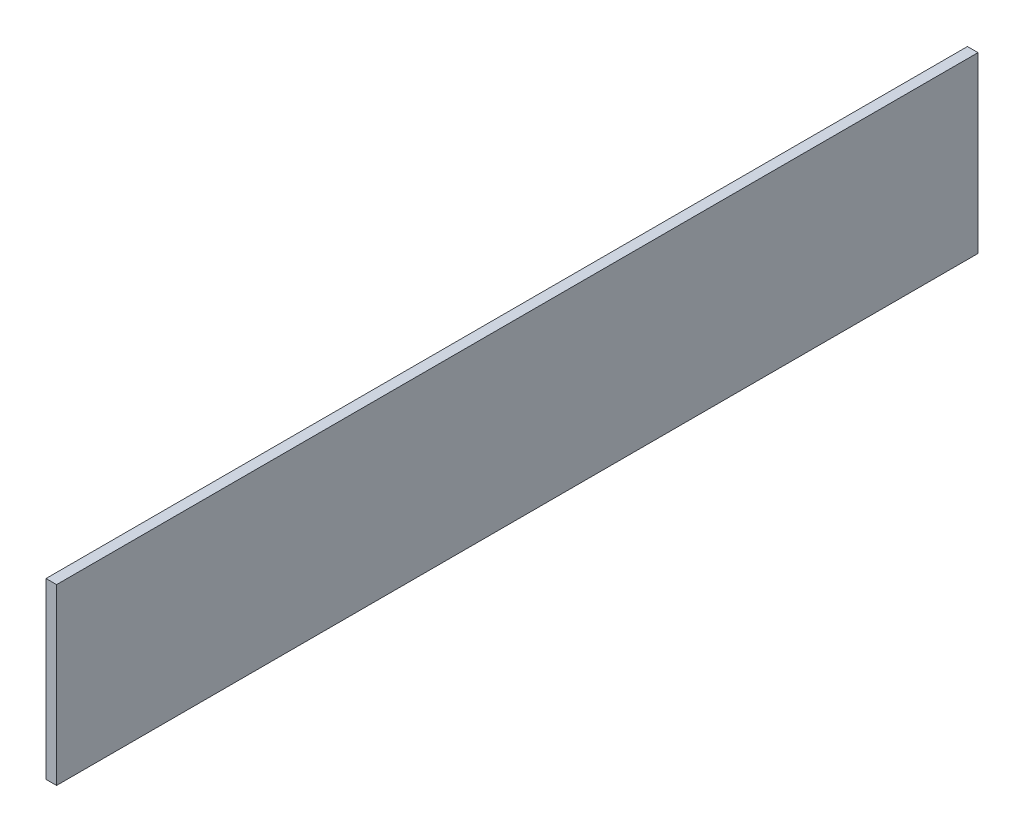
ISO-10303-21;
HEADER;
FILE_DESCRIPTION(('STEP AP214'),'2;1');
FILE_NAME('part.step','',(''),(''),'','','');
FILE_SCHEMA(('AUTOMOTIVE_DESIGN { 1 0 10303 214 1 1 1 1 }'));
ENDSEC;
DATA;
#1=APPLICATION_CONTEXT('core data for automotive mechanical design processes');
#2=APPLICATION_PROTOCOL_DEFINITION('international standard','automotive_design',2000,#1);
#3=PRODUCT_CONTEXT('',#1,'mechanical');
#4=PRODUCT('Part','Part','',(#3));
#5=PRODUCT_RELATED_PRODUCT_CATEGORY('part','',(#4));
#6=PRODUCT_DEFINITION_FORMATION('','',#4);
#7=PRODUCT_DEFINITION_CONTEXT('part definition',#1,'design');
#8=PRODUCT_DEFINITION('design','',#6,#7);
#9=PRODUCT_DEFINITION_SHAPE('','',#8);
#10=(LENGTH_UNIT() NAMED_UNIT(*) SI_UNIT(.MILLI.,.METRE.));
#11=(NAMED_UNIT(*) PLANE_ANGLE_UNIT() SI_UNIT($,.RADIAN.));
#12=(NAMED_UNIT(*) SI_UNIT($,.STERADIAN.) SOLID_ANGLE_UNIT());
#13=UNCERTAINTY_MEASURE_WITH_UNIT(LENGTH_MEASURE(1.E-05),#10,'distance_accuracy_value','');
#14=(GEOMETRIC_REPRESENTATION_CONTEXT(3) GLOBAL_UNCERTAINTY_ASSIGNED_CONTEXT((#13)) GLOBAL_UNIT_ASSIGNED_CONTEXT((#10,
#11,#12)) REPRESENTATION_CONTEXT('',''));
#15=CARTESIAN_POINT('',(0.,0.,0.));
#16=DIRECTION('',(0.,0.,1.));
#17=DIRECTION('',(1.,0.,0.));
#18=AXIS2_PLACEMENT_3D('',#15,#16,#17);
#19=CARTESIAN_POINT('',(0.,56.,-148.309470123421));
#20=DIRECTION('',(0.,0.,1.));
#21=DIRECTION('',(1.,0.,0.));
#22=AXIS2_PLACEMENT_3D('',#19,#20,#21);
#23=PLANE('',#22);
#24=DIRECTION('',(-1.,0.,0.));
#25=VECTOR('',#24,1.);
#26=CARTESIAN_POINT('',(0.,0.,-148.309470123421));
#27=LINE('',#26,#25);
#28=CARTESIAN_POINT('',(-105.433818413819,0.,-148.309470123421));
#29=VERTEX_POINT('',#28);
#30=CARTESIAN_POINT('',(-108.837639200547,0.,-148.309470123421));
#31=VERTEX_POINT('',#30);
#32=EDGE_CURVE('E109',#29,#31,#27,.T.);
#33=ORIENTED_EDGE('',*,*,#32,.T.);
#34=DIRECTION('',(0.,-1.,0.));
#35=VECTOR('',#34,1.);
#36=CARTESIAN_POINT('',(-108.837639200547,56.,-148.309470123421));
#37=LINE('',#36,#35);
#38=CARTESIAN_POINT('',(-108.837639200547,56.,-148.309470123421));
#39=VERTEX_POINT('',#38);
#40=EDGE_CURVE('E11',#39,#31,#37,.T.);
#41=ORIENTED_EDGE('',*,*,#40,.F.);
#42=DIRECTION('',(-1.,0.,0.));
#43=VECTOR('',#42,1.);
#44=CARTESIAN_POINT('',(0.,56.,-148.309470123421));
#45=LINE('',#44,#43);
#46=CARTESIAN_POINT('',(-105.433818413819,56.,-148.309470123421));
#47=VERTEX_POINT('',#46);
#48=EDGE_CURVE('E91',#47,#39,#45,.T.);
#49=ORIENTED_EDGE('',*,*,#48,.F.);
#50=DIRECTION('',(0.,-1.,0.));
#51=VECTOR('',#50,1.);
#52=CARTESIAN_POINT('',(-105.433818413819,56.,-148.309470123421));
#53=LINE('',#52,#51);
#54=EDGE_CURVE('E58',#47,#29,#53,.T.);
#55=ORIENTED_EDGE('',*,*,#54,.T.);
#56=EDGE_LOOP('',(#33,#41,#49,#55));
#57=FACE_BOUND('',#56,.T.);
#58=ADVANCED_FACE('F41',(#57),#23,.F.);
#59=CARTESIAN_POINT('',(-108.837639200547,56.,0.));
#60=DIRECTION('',(1.,0.,0.));
#61=DIRECTION('',(0.,0.,-1.));
#62=AXIS2_PLACEMENT_3D('',#59,#60,#61);
#63=PLANE('',#62);
#64=DIRECTION('',(0.,0.,1.));
#65=VECTOR('',#64,1.);
#66=CARTESIAN_POINT('',(-108.837639200547,0.,0.));
#67=LINE('',#66,#65);
#68=CARTESIAN_POINT('',(-108.837639200547,0.,148.309470123421));
#69=VERTEX_POINT('',#68);
#70=EDGE_CURVE('E97',#31,#69,#67,.T.);
#71=ORIENTED_EDGE('',*,*,#70,.T.);
#72=DIRECTION('',(0.,-1.,0.));
#73=VECTOR('',#72,1.);
#74=CARTESIAN_POINT('',(-108.837639200547,56.,148.309470123421));
#75=LINE('',#74,#73);
#76=CARTESIAN_POINT('',(-108.837639200547,56.,148.309470123421));
#77=VERTEX_POINT('',#76);
#78=EDGE_CURVE('E50',#77,#69,#75,.T.);
#79=ORIENTED_EDGE('',*,*,#78,.F.);
#80=DIRECTION('',(0.,0.,1.));
#81=VECTOR('',#80,1.);
#82=CARTESIAN_POINT('',(-108.837639200547,56.,0.));
#83=LINE('',#82,#81);
#84=EDGE_CURVE('E83',#39,#77,#83,.T.);
#85=ORIENTED_EDGE('',*,*,#84,.F.);
#86=ORIENTED_EDGE('',*,*,#40,.T.);
#87=EDGE_LOOP('',(#71,#79,#85,#86));
#88=FACE_BOUND('',#87,.T.);
#89=ADVANCED_FACE('F96',(#88),#63,.F.);
#90=CARTESIAN_POINT('',(0.,56.,148.309470123421));
#91=DIRECTION('',(0.,0.,1.));
#92=DIRECTION('',(1.,0.,0.));
#93=AXIS2_PLACEMENT_3D('',#90,#91,#92);
#94=PLANE('',#93);
#95=DIRECTION('',(-1.,0.,0.));
#96=VECTOR('',#95,1.);
#97=CARTESIAN_POINT('',(0.,0.,148.309470123421));
#98=LINE('',#97,#96);
#99=CARTESIAN_POINT('',(-105.433818413819,0.,148.309470123421));
#100=VERTEX_POINT('',#99);
#101=EDGE_CURVE('E114',#100,#69,#98,.T.);
#102=ORIENTED_EDGE('',*,*,#101,.F.);
#103=DIRECTION('',(0.,-1.,0.));
#104=VECTOR('',#103,1.);
#105=CARTESIAN_POINT('',(-105.433818413819,56.,148.309470123421));
#106=LINE('',#105,#104);
#107=CARTESIAN_POINT('',(-105.433818413819,56.,148.309470123421));
#108=VERTEX_POINT('',#107);
#109=EDGE_CURVE('E72',#108,#100,#106,.T.);
#110=ORIENTED_EDGE('',*,*,#109,.F.);
#111=DIRECTION('',(-1.,0.,0.));
#112=VECTOR('',#111,1.);
#113=CARTESIAN_POINT('',(0.,56.,148.309470123421));
#114=LINE('',#113,#112);
#115=EDGE_CURVE('E90',#108,#77,#114,.T.);
#116=ORIENTED_EDGE('',*,*,#115,.T.);
#117=ORIENTED_EDGE('',*,*,#78,.T.);
#118=EDGE_LOOP('',(#102,#110,#116,#117));
#119=FACE_BOUND('',#118,.T.);
#120=ADVANCED_FACE('F101',(#119),#94,.T.);
#121=CARTESIAN_POINT('',(-105.433818413819,56.,0.));
#122=DIRECTION('',(1.,0.,0.));
#123=DIRECTION('',(0.,0.,-1.));
#124=AXIS2_PLACEMENT_3D('',#121,#122,#123);
#125=PLANE('',#124);
#126=DIRECTION('',(0.,0.,1.));
#127=VECTOR('',#126,1.);
#128=CARTESIAN_POINT('',(-105.433818413819,0.,0.));
#129=LINE('',#128,#127);
#130=EDGE_CURVE('E117',#29,#100,#129,.T.);
#131=ORIENTED_EDGE('',*,*,#130,.F.);
#132=ORIENTED_EDGE('',*,*,#54,.F.);
#133=DIRECTION('',(0.,0.,1.));
#134=VECTOR('',#133,1.);
#135=CARTESIAN_POINT('',(-105.433818413819,56.,0.));
#136=LINE('',#135,#134);
#137=EDGE_CURVE('E103',#47,#108,#136,.T.);
#138=ORIENTED_EDGE('',*,*,#137,.T.);
#139=ORIENTED_EDGE('',*,*,#109,.T.);
#140=EDGE_LOOP('',(#131,#132,#138,#139));
#141=FACE_BOUND('',#140,.T.);
#142=ADVANCED_FACE('F127',(#141),#125,.T.);
#143=CARTESIAN_POINT('',(0.,56.,0.));
#144=DIRECTION('',(0.,1.,0.));
#145=DIRECTION('',(0.,0.,1.));
#146=AXIS2_PLACEMENT_3D('',#143,#144,#145);
#147=PLANE('',#146);
#148=ORIENTED_EDGE('',*,*,#48,.T.);
#149=ORIENTED_EDGE('',*,*,#84,.T.);
#150=ORIENTED_EDGE('',*,*,#115,.F.);
#151=ORIENTED_EDGE('',*,*,#137,.F.);
#152=EDGE_LOOP('',(#148,#149,#150,#151));
#153=FACE_BOUND('',#152,.T.);
#154=ADVANCED_FACE('F87',(#153),#147,.T.);
#155=CARTESIAN_POINT('',(0.,0.,0.));
#156=DIRECTION('',(0.,1.,0.));
#157=DIRECTION('',(0.,0.,1.));
#158=AXIS2_PLACEMENT_3D('',#155,#156,#157);
#159=PLANE('',#158);
#160=ORIENTED_EDGE('',*,*,#32,.F.);
#161=ORIENTED_EDGE('',*,*,#130,.T.);
#162=ORIENTED_EDGE('',*,*,#101,.T.);
#163=ORIENTED_EDGE('',*,*,#70,.F.);
#164=EDGE_LOOP('',(#160,#161,#162,#163));
#165=FACE_BOUND('',#164,.T.);
#166=ADVANCED_FACE('F126',(#165),#159,.F.);
#167=CLOSED_SHELL('',(#58,#89,#120,#142,#154,#166));
#168=MANIFOLD_SOLID_BREP('B2',#167);
#169=ADVANCED_BREP_SHAPE_REPRESENTATION('',(#18,#168),#14);
#170=SHAPE_DEFINITION_REPRESENTATION(#9,#169);
ENDSEC;
END-ISO-10303-21;
